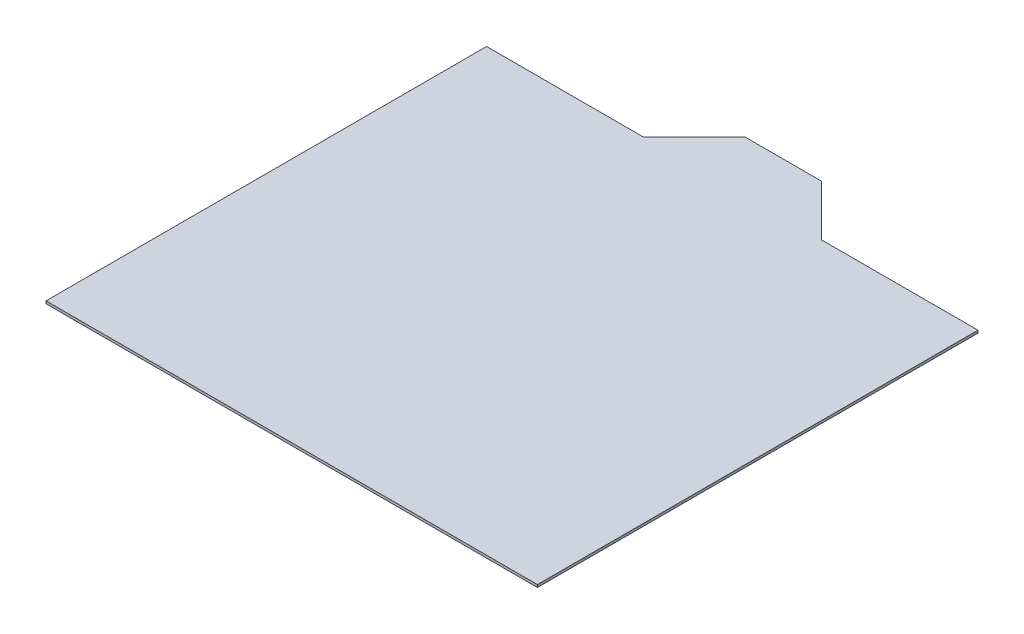
ISO-10303-21;
HEADER;
FILE_DESCRIPTION(('STEP AP214'),'2;1');
FILE_NAME('part.step','',(''),(''),'','','');
FILE_SCHEMA(('AUTOMOTIVE_DESIGN { 1 0 10303 214 1 1 1 1 }'));
ENDSEC;
DATA;
#1=APPLICATION_CONTEXT('core data for automotive mechanical design processes');
#2=APPLICATION_PROTOCOL_DEFINITION('international standard','automotive_design',2000,#1);
#3=PRODUCT_CONTEXT('',#1,'mechanical');
#4=PRODUCT('Part','Part','',(#3));
#5=PRODUCT_RELATED_PRODUCT_CATEGORY('part','',(#4));
#6=PRODUCT_DEFINITION_FORMATION('','',#4);
#7=PRODUCT_DEFINITION_CONTEXT('part definition',#1,'design');
#8=PRODUCT_DEFINITION('design','',#6,#7);
#9=PRODUCT_DEFINITION_SHAPE('','',#8);
#10=(LENGTH_UNIT() NAMED_UNIT(*) SI_UNIT(.MILLI.,.METRE.));
#11=(NAMED_UNIT(*) PLANE_ANGLE_UNIT() SI_UNIT($,.RADIAN.));
#12=(NAMED_UNIT(*) SI_UNIT($,.STERADIAN.) SOLID_ANGLE_UNIT());
#13=UNCERTAINTY_MEASURE_WITH_UNIT(LENGTH_MEASURE(1.E-05),#10,'distance_accuracy_value','');
#14=(GEOMETRIC_REPRESENTATION_CONTEXT(3) GLOBAL_UNCERTAINTY_ASSIGNED_CONTEXT((#13)) GLOBAL_UNIT_ASSIGNED_CONTEXT((#10,
#11,#12)) REPRESENTATION_CONTEXT('',''));
#15=CARTESIAN_POINT('',(0.,0.,0.));
#16=DIRECTION('',(0.,0.,1.));
#17=DIRECTION('',(1.,0.,0.));
#18=AXIS2_PLACEMENT_3D('',#15,#16,#17);
#19=CARTESIAN_POINT('',(91.2499999999997,1.5,-91.250000000002));
#20=DIRECTION('',(0.707106781186539,0.,-0.707106781186556));
#21=DIRECTION('',(-0.707106781186556,0.,-0.707106781186539));
#22=AXIS2_PLACEMENT_3D('',#19,#20,#21);
#23=PLANE('',#22);
#24=DIRECTION('',(0.707106781186556,0.,0.707106781186539));
#25=VECTOR('',#24,1.);
#26=CARTESIAN_POINT('',(91.2499999999997,0.,-91.250000000002));
#27=LINE('',#26,#25);
#28=CARTESIAN_POINT('',(22.5,0.,-160.));
#29=VERTEX_POINT('',#28);
#30=CARTESIAN_POINT('',(52.5000000000008,0.,-130.));
#31=VERTEX_POINT('',#30);
#32=EDGE_CURVE('E131',#29,#31,#27,.T.);
#33=ORIENTED_EDGE('',*,*,#32,.F.);
#34=DIRECTION('',(0.,-1.,0.));
#35=VECTOR('',#34,1.);
#36=CARTESIAN_POINT('',(22.5,1.5,-160.));
#37=LINE('',#36,#35);
#38=CARTESIAN_POINT('',(22.5,1.5,-160.));
#39=VERTEX_POINT('',#38);
#40=EDGE_CURVE('E11',#39,#29,#37,.T.);
#41=ORIENTED_EDGE('',*,*,#40,.F.);
#42=DIRECTION('',(0.707106781186556,0.,0.707106781186539));
#43=VECTOR('',#42,1.);
#44=CARTESIAN_POINT('',(91.2499999999997,1.5,-91.250000000002));
#45=LINE('',#44,#43);
#46=CARTESIAN_POINT('',(52.5000000000008,1.5,-130.));
#47=VERTEX_POINT('',#46);
#48=EDGE_CURVE('E172',#39,#47,#45,.T.);
#49=ORIENTED_EDGE('',*,*,#48,.T.);
#50=DIRECTION('',(0.,-1.,0.));
#51=VECTOR('',#50,1.);
#52=CARTESIAN_POINT('',(52.5000000000008,1.5,-130.));
#53=LINE('',#52,#51);
#54=EDGE_CURVE('E53',#47,#31,#53,.T.);
#55=ORIENTED_EDGE('',*,*,#54,.T.);
#56=EDGE_LOOP('',(#33,#41,#49,#55));
#57=FACE_BOUND('',#56,.T.);
#58=ADVANCED_FACE('F37',(#57),#23,.T.);
#59=CARTESIAN_POINT('',(0.,1.5,-160.));
#60=DIRECTION('',(0.,0.,-1.));
#61=DIRECTION('',(-1.,0.,0.));
#62=AXIS2_PLACEMENT_3D('',#59,#60,#61);
#63=PLANE('',#62);
#64=DIRECTION('',(1.,0.,0.));
#65=VECTOR('',#64,1.);
#66=CARTESIAN_POINT('',(0.,0.,-160.));
#67=LINE('',#66,#65);
#68=CARTESIAN_POINT('',(-22.5,0.,-160.));
#69=VERTEX_POINT('',#68);
#70=EDGE_CURVE('E133',#69,#29,#67,.T.);
#71=ORIENTED_EDGE('',*,*,#70,.F.);
#72=DIRECTION('',(0.,-1.,0.));
#73=VECTOR('',#72,1.);
#74=CARTESIAN_POINT('',(-22.5,1.5,-160.));
#75=LINE('',#74,#73);
#76=CARTESIAN_POINT('',(-22.5,1.5,-160.));
#77=VERTEX_POINT('',#76);
#78=EDGE_CURVE('E45',#77,#69,#75,.T.);
#79=ORIENTED_EDGE('',*,*,#78,.F.);
#80=DIRECTION('',(1.,0.,0.));
#81=VECTOR('',#80,1.);
#82=CARTESIAN_POINT('',(0.,1.5,-160.));
#83=LINE('',#82,#81);
#84=EDGE_CURVE('E169',#77,#39,#83,.T.);
#85=ORIENTED_EDGE('',*,*,#84,.T.);
#86=ORIENTED_EDGE('',*,*,#40,.T.);
#87=EDGE_LOOP('',(#71,#79,#85,#86));
#88=FACE_BOUND('',#87,.T.);
#89=ADVANCED_FACE('F168',(#88),#63,.T.);
#90=CARTESIAN_POINT('',(-91.2499999999997,1.5,-91.250000000002));
#91=DIRECTION('',(0.707106781186539,0.,0.707106781186556));
#92=DIRECTION('',(0.707106781186556,0.,-0.707106781186539));
#93=AXIS2_PLACEMENT_3D('',#90,#91,#92);
#94=PLANE('',#93);
#95=DIRECTION('',(-0.707106781186556,0.,0.707106781186539));
#96=VECTOR('',#95,1.);
#97=CARTESIAN_POINT('',(-91.2499999999997,0.,-91.250000000002));
#98=LINE('',#97,#96);
#99=CARTESIAN_POINT('',(-52.5000000000008,0.,-130.));
#100=VERTEX_POINT('',#99);
#101=EDGE_CURVE('E136',#69,#100,#98,.T.);
#102=ORIENTED_EDGE('',*,*,#101,.T.);
#103=DIRECTION('',(0.,-1.,0.));
#104=VECTOR('',#103,1.);
#105=CARTESIAN_POINT('',(-52.5000000000008,1.5,-130.));
#106=LINE('',#105,#104);
#107=CARTESIAN_POINT('',(-52.5000000000008,1.5,-130.));
#108=VERTEX_POINT('',#107);
#109=EDGE_CURVE('E154',#108,#100,#106,.T.);
#110=ORIENTED_EDGE('',*,*,#109,.F.);
#111=DIRECTION('',(-0.707106781186556,0.,0.707106781186539));
#112=VECTOR('',#111,1.);
#113=CARTESIAN_POINT('',(-91.2499999999997,1.5,-91.250000000002));
#114=LINE('',#113,#112);
#115=EDGE_CURVE('E160',#77,#108,#114,.T.);
#116=ORIENTED_EDGE('',*,*,#115,.F.);
#117=ORIENTED_EDGE('',*,*,#78,.T.);
#118=EDGE_LOOP('',(#102,#110,#116,#117));
#119=FACE_BOUND('',#118,.T.);
#120=ADVANCED_FACE('F158',(#119),#94,.F.);
#121=CARTESIAN_POINT('',(0.,1.5,-130.));
#122=DIRECTION('',(0.,0.,-1.));
#123=DIRECTION('',(-1.,0.,0.));
#124=AXIS2_PLACEMENT_3D('',#121,#122,#123);
#125=PLANE('',#124);
#126=DIRECTION('',(1.,0.,0.));
#127=VECTOR('',#126,1.);
#128=CARTESIAN_POINT('',(0.,0.,-130.));
#129=LINE('',#128,#127);
#130=CARTESIAN_POINT('',(-145.,0.,-130.));
#131=VERTEX_POINT('',#130);
#132=EDGE_CURVE('E139',#131,#100,#129,.T.);
#133=ORIENTED_EDGE('',*,*,#132,.F.);
#134=DIRECTION('',(0.,-1.,0.));
#135=VECTOR('',#134,1.);
#136=CARTESIAN_POINT('',(-145.,1.5,-130.));
#137=LINE('',#136,#135);
#138=CARTESIAN_POINT('',(-145.,1.5,-130.));
#139=VERTEX_POINT('',#138);
#140=EDGE_CURVE('E152',#139,#131,#137,.T.);
#141=ORIENTED_EDGE('',*,*,#140,.F.);
#142=DIRECTION('',(1.,0.,0.));
#143=VECTOR('',#142,1.);
#144=CARTESIAN_POINT('',(0.,1.5,-130.));
#145=LINE('',#144,#143);
#146=EDGE_CURVE('E128',#139,#108,#145,.T.);
#147=ORIENTED_EDGE('',*,*,#146,.T.);
#148=ORIENTED_EDGE('',*,*,#109,.T.);
#149=EDGE_LOOP('',(#133,#141,#147,#148));
#150=FACE_BOUND('',#149,.T.);
#151=ADVANCED_FACE('F181',(#150),#125,.T.);
#152=CARTESIAN_POINT('',(-145.,1.5,0.));
#153=DIRECTION('',(-1.,0.,0.));
#154=DIRECTION('',(0.,0.,1.));
#155=AXIS2_PLACEMENT_3D('',#152,#153,#154);
#156=PLANE('',#155);
#157=DIRECTION('',(0.,0.,-1.));
#158=VECTOR('',#157,1.);
#159=CARTESIAN_POINT('',(-145.,0.,0.));
#160=LINE('',#159,#158);
#161=CARTESIAN_POINT('',(-145.,0.,130.));
#162=VERTEX_POINT('',#161);
#163=EDGE_CURVE('E142',#162,#131,#160,.T.);
#164=ORIENTED_EDGE('',*,*,#163,.F.);
#165=DIRECTION('',(0.,-1.,0.));
#166=VECTOR('',#165,1.);
#167=CARTESIAN_POINT('',(-145.,1.5,130.));
#168=LINE('',#167,#166);
#169=CARTESIAN_POINT('',(-145.,1.5,130.));
#170=VERTEX_POINT('',#169);
#171=EDGE_CURVE('E122',#170,#162,#168,.T.);
#172=ORIENTED_EDGE('',*,*,#171,.F.);
#173=DIRECTION('',(0.,0.,-1.));
#174=VECTOR('',#173,1.);
#175=CARTESIAN_POINT('',(-145.,1.5,0.));
#176=LINE('',#175,#174);
#177=EDGE_CURVE('E112',#170,#139,#176,.T.);
#178=ORIENTED_EDGE('',*,*,#177,.T.);
#179=ORIENTED_EDGE('',*,*,#140,.T.);
#180=EDGE_LOOP('',(#164,#172,#178,#179));
#181=FACE_BOUND('',#180,.T.);
#182=ADVANCED_FACE('F179',(#181),#156,.T.);
#183=CARTESIAN_POINT('',(0.,1.5,130.));
#184=DIRECTION('',(0.,0.,-1.));
#185=DIRECTION('',(-1.,0.,0.));
#186=AXIS2_PLACEMENT_3D('',#183,#184,#185);
#187=PLANE('',#186);
#188=DIRECTION('',(1.,0.,0.));
#189=VECTOR('',#188,1.);
#190=CARTESIAN_POINT('',(0.,0.,130.));
#191=LINE('',#190,#189);
#192=CARTESIAN_POINT('',(145.,0.,130.));
#193=VERTEX_POINT('',#192);
#194=EDGE_CURVE('E119',#162,#193,#191,.T.);
#195=ORIENTED_EDGE('',*,*,#194,.T.);
#196=DIRECTION('',(0.,-1.,0.));
#197=VECTOR('',#196,1.);
#198=CARTESIAN_POINT('',(145.,1.5,130.));
#199=LINE('',#198,#197);
#200=CARTESIAN_POINT('',(145.,1.5,130.));
#201=VERTEX_POINT('',#200);
#202=EDGE_CURVE('E116',#201,#193,#199,.T.);
#203=ORIENTED_EDGE('',*,*,#202,.F.);
#204=DIRECTION('',(1.,0.,0.));
#205=VECTOR('',#204,1.);
#206=CARTESIAN_POINT('',(0.,1.5,130.));
#207=LINE('',#206,#205);
#208=EDGE_CURVE('E104',#170,#201,#207,.T.);
#209=ORIENTED_EDGE('',*,*,#208,.F.);
#210=ORIENTED_EDGE('',*,*,#171,.T.);
#211=EDGE_LOOP('',(#195,#203,#209,#210));
#212=FACE_BOUND('',#211,.T.);
#213=ADVANCED_FACE('F117',(#212),#187,.F.);
#214=CARTESIAN_POINT('',(145.,1.5,0.));
#215=DIRECTION('',(-1.,0.,0.));
#216=DIRECTION('',(0.,0.,1.));
#217=AXIS2_PLACEMENT_3D('',#214,#215,#216);
#218=PLANE('',#217);
#219=DIRECTION('',(0.,0.,-1.));
#220=VECTOR('',#219,1.);
#221=CARTESIAN_POINT('',(145.,0.,0.));
#222=LINE('',#221,#220);
#223=CARTESIAN_POINT('',(145.,0.,-130.));
#224=VERTEX_POINT('',#223);
#225=EDGE_CURVE('E147',#193,#224,#222,.T.);
#226=ORIENTED_EDGE('',*,*,#225,.T.);
#227=DIRECTION('',(0.,-1.,0.));
#228=VECTOR('',#227,1.);
#229=CARTESIAN_POINT('',(145.,1.5,-130.));
#230=LINE('',#229,#228);
#231=CARTESIAN_POINT('',(145.,1.5,-130.));
#232=VERTEX_POINT('',#231);
#233=EDGE_CURVE('E79',#232,#224,#230,.T.);
#234=ORIENTED_EDGE('',*,*,#233,.F.);
#235=DIRECTION('',(0.,0.,-1.));
#236=VECTOR('',#235,1.);
#237=CARTESIAN_POINT('',(145.,1.5,0.));
#238=LINE('',#237,#236);
#239=EDGE_CURVE('E109',#201,#232,#238,.T.);
#240=ORIENTED_EDGE('',*,*,#239,.F.);
#241=ORIENTED_EDGE('',*,*,#202,.T.);
#242=EDGE_LOOP('',(#226,#234,#240,#241));
#243=FACE_BOUND('',#242,.T.);
#244=ADVANCED_FACE('F124',(#243),#218,.F.);
#245=EDGE_CURVE('E143',#31,#224,#129,.T.);
#246=ORIENTED_EDGE('',*,*,#245,.F.);
#247=ORIENTED_EDGE('',*,*,#54,.F.);
#248=EDGE_CURVE('E125',#47,#232,#145,.T.);
#249=ORIENTED_EDGE('',*,*,#248,.T.);
#250=ORIENTED_EDGE('',*,*,#233,.T.);
#251=EDGE_LOOP('',(#246,#247,#249,#250));
#252=FACE_BOUND('',#251,.T.);
#253=ADVANCED_FACE('F171',(#252),#125,.T.);
#254=CARTESIAN_POINT('',(0.,1.5,0.));
#255=DIRECTION('',(0.,1.,0.));
#256=DIRECTION('',(0.,0.,1.));
#257=AXIS2_PLACEMENT_3D('',#254,#255,#256);
#258=PLANE('',#257);
#259=ORIENTED_EDGE('',*,*,#48,.F.);
#260=ORIENTED_EDGE('',*,*,#84,.F.);
#261=ORIENTED_EDGE('',*,*,#115,.T.);
#262=ORIENTED_EDGE('',*,*,#146,.F.);
#263=ORIENTED_EDGE('',*,*,#177,.F.);
#264=ORIENTED_EDGE('',*,*,#208,.T.);
#265=ORIENTED_EDGE('',*,*,#239,.T.);
#266=ORIENTED_EDGE('',*,*,#248,.F.);
#267=EDGE_LOOP('',(#259,#260,#261,#262,#263,#264,#265,#266));
#268=FACE_BOUND('',#267,.T.);
#269=ADVANCED_FACE('F106',(#268),#258,.T.);
#270=CARTESIAN_POINT('',(0.,0.,0.));
#271=DIRECTION('',(0.,1.,0.));
#272=DIRECTION('',(0.,0.,1.));
#273=AXIS2_PLACEMENT_3D('',#270,#271,#272);
#274=PLANE('',#273);
#275=ORIENTED_EDGE('',*,*,#32,.T.);
#276=ORIENTED_EDGE('',*,*,#245,.T.);
#277=ORIENTED_EDGE('',*,*,#225,.F.);
#278=ORIENTED_EDGE('',*,*,#194,.F.);
#279=ORIENTED_EDGE('',*,*,#163,.T.);
#280=ORIENTED_EDGE('',*,*,#132,.T.);
#281=ORIENTED_EDGE('',*,*,#101,.F.);
#282=ORIENTED_EDGE('',*,*,#70,.T.);
#283=EDGE_LOOP('',(#275,#276,#277,#278,#279,#280,#281,#282));
#284=FACE_BOUND('',#283,.T.);
#285=ADVANCED_FACE('F166',(#284),#274,.F.);
#286=CLOSED_SHELL('',(#58,#89,#120,#151,#182,#213,#244,#253,#269,#285));
#287=MANIFOLD_SOLID_BREP('B2',#286);
#288=ADVANCED_BREP_SHAPE_REPRESENTATION('',(#18,#287),#14);
#289=SHAPE_DEFINITION_REPRESENTATION(#9,#288);
ENDSEC;
END-ISO-10303-21;
